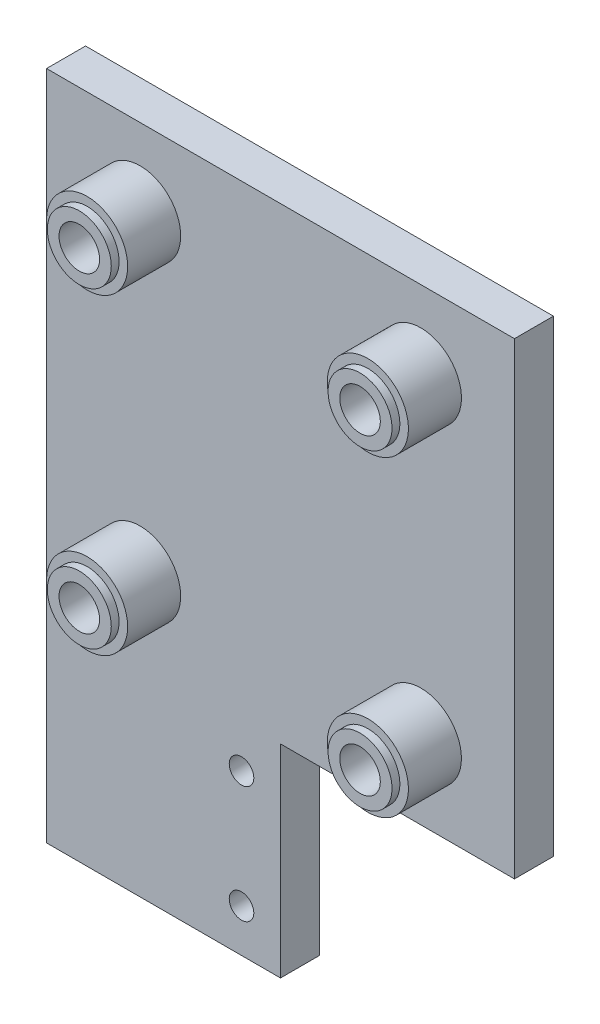
ISO-10303-21;
HEADER;
FILE_DESCRIPTION(('STEP AP214'),'2;1');
FILE_NAME('part.step','',(''),(''),'','','');
FILE_SCHEMA(('AUTOMOTIVE_DESIGN { 1 0 10303 214 1 1 1 1 }'));
ENDSEC;
DATA;
#1=APPLICATION_CONTEXT('core data for automotive mechanical design processes');
#2=APPLICATION_PROTOCOL_DEFINITION('international standard','automotive_design',2000,#1);
#3=PRODUCT_CONTEXT('',#1,'mechanical');
#4=PRODUCT('Part','Part','',(#3));
#5=PRODUCT_RELATED_PRODUCT_CATEGORY('part','',(#4));
#6=PRODUCT_DEFINITION_FORMATION('','',#4);
#7=PRODUCT_DEFINITION_CONTEXT('part definition',#1,'design');
#8=PRODUCT_DEFINITION('design','',#6,#7);
#9=PRODUCT_DEFINITION_SHAPE('','',#8);
#10=(LENGTH_UNIT() NAMED_UNIT(*) SI_UNIT(.MILLI.,.METRE.));
#11=(NAMED_UNIT(*) PLANE_ANGLE_UNIT() SI_UNIT($,.RADIAN.));
#12=(NAMED_UNIT(*) SI_UNIT($,.STERADIAN.) SOLID_ANGLE_UNIT());
#13=UNCERTAINTY_MEASURE_WITH_UNIT(LENGTH_MEASURE(1.E-05),#10,'distance_accuracy_value','');
#14=(GEOMETRIC_REPRESENTATION_CONTEXT(3) GLOBAL_UNCERTAINTY_ASSIGNED_CONTEXT((#13)) GLOBAL_UNIT_ASSIGNED_CONTEXT((#10,
#11,#12)) REPRESENTATION_CONTEXT('',''));
#15=CARTESIAN_POINT('',(0.,0.,0.));
#16=DIRECTION('',(0.,0.,1.));
#17=DIRECTION('',(1.,0.,0.));
#18=AXIS2_PLACEMENT_3D('',#15,#16,#17);
#19=CARTESIAN_POINT('',(-22.86,-25.4,16.256));
#20=DIRECTION('',(0.,0.,-1.));
#21=DIRECTION('',(-1.,0.,0.));
#22=AXIS2_PLACEMENT_3D('',#19,#20,#21);
#23=CYLINDRICAL_SURFACE('',#22,6.604);
#24=CARTESIAN_POINT('',(-22.86,-25.4,6.35));
#25=DIRECTION('',(0.,0.,-1.));
#26=DIRECTION('',(-1.,0.,0.));
#27=AXIS2_PLACEMENT_3D('',#24,#25,#26);
#28=CIRCLE('',#27,6.604);
#29=CARTESIAN_POINT('',(-29.464,-25.4,6.35));
#30=VERTEX_POINT('',#29);
#31=EDGE_CURVE('E187',#30,#30,#28,.T.);
#32=ORIENTED_EDGE('',*,*,#31,.F.);
#33=EDGE_LOOP('',(#32));
#34=FACE_BOUND('',#33,.T.);
#35=CARTESIAN_POINT('',(-22.86,-25.4,14.986));
#36=DIRECTION('',(0.,0.,-1.));
#37=DIRECTION('',(1.,0.,0.));
#38=AXIS2_PLACEMENT_3D('',#35,#36,#37);
#39=CIRCLE('',#38,6.604);
#40=CARTESIAN_POINT('',(-16.256,-25.4,14.986));
#41=VERTEX_POINT('',#40);
#42=EDGE_CURVE('E172',#41,#41,#39,.T.);
#43=ORIENTED_EDGE('',*,*,#42,.T.);
#44=EDGE_LOOP('',(#43));
#45=FACE_BOUND('',#44,.T.);
#46=ADVANCED_FACE('F39',(#34,#45),#23,.T.);
#47=CARTESIAN_POINT('',(-22.86,-25.4,16.256));
#48=DIRECTION('',(0.,0.,-1.));
#49=DIRECTION('',(-1.,0.,0.));
#50=AXIS2_PLACEMENT_3D('',#47,#48,#49);
#51=PLANE('',#50);
#52=CARTESIAN_POINT('',(-22.86,-25.4,16.256));
#53=DIRECTION('',(0.,0.,-1.));
#54=DIRECTION('',(-1.,0.,0.));
#55=AXIS2_PLACEMENT_3D('',#52,#53,#54);
#56=CIRCLE('',#55,3.302);
#57=CARTESIAN_POINT('',(-26.162,-25.4,16.256));
#58=VERTEX_POINT('',#57);
#59=EDGE_CURVE('E179',#58,#58,#56,.T.);
#60=ORIENTED_EDGE('',*,*,#59,.T.);
#61=EDGE_LOOP('',(#60));
#62=FACE_BOUND('',#61,.T.);
#63=CARTESIAN_POINT('',(-22.86,-25.4,16.256));
#64=DIRECTION('',(0.,0.,-1.));
#65=DIRECTION('',(1.,0.,0.));
#66=AXIS2_PLACEMENT_3D('',#63,#64,#65);
#67=CIRCLE('',#66,5.207);
#68=CARTESIAN_POINT('',(-17.653,-25.4,16.256));
#69=VERTEX_POINT('',#68);
#70=EDGE_CURVE('E173',#69,#69,#67,.T.);
#71=ORIENTED_EDGE('',*,*,#70,.F.);
#72=EDGE_LOOP('',(#71));
#73=FACE_BOUND('',#72,.T.);
#74=ADVANCED_FACE('F262',(#62,#73),#51,.F.);
#75=CARTESIAN_POINT('',(22.86,-25.4,16.256));
#76=DIRECTION('',(0.,0.,1.));
#77=DIRECTION('',(1.,0.,0.));
#78=AXIS2_PLACEMENT_3D('',#75,#76,#77);
#79=PLANE('',#78);
#80=CARTESIAN_POINT('',(22.86,-25.4,16.256));
#81=DIRECTION('',(0.,0.,-1.));
#82=DIRECTION('',(1.,0.,0.));
#83=AXIS2_PLACEMENT_3D('',#80,#81,#82);
#84=CIRCLE('',#83,3.302);
#85=CARTESIAN_POINT('',(26.162,-25.4,16.256));
#86=VERTEX_POINT('',#85);
#87=EDGE_CURVE('E188',#86,#86,#84,.T.);
#88=ORIENTED_EDGE('',*,*,#87,.T.);
#89=EDGE_LOOP('',(#88));
#90=FACE_BOUND('',#89,.T.);
#91=CARTESIAN_POINT('',(22.86,-25.4,16.256));
#92=DIRECTION('',(0.,0.,-1.));
#93=DIRECTION('',(-1.,0.,0.));
#94=AXIS2_PLACEMENT_3D('',#91,#92,#93);
#95=CIRCLE('',#94,5.207);
#96=CARTESIAN_POINT('',(17.653,-25.4,16.256));
#97=VERTEX_POINT('',#96);
#98=EDGE_CURVE('E141',#97,#97,#95,.T.);
#99=ORIENTED_EDGE('',*,*,#98,.F.);
#100=EDGE_LOOP('',(#99));
#101=FACE_BOUND('',#100,.T.);
#102=ADVANCED_FACE('F269',(#90,#101),#79,.T.);
#103=CARTESIAN_POINT('',(-22.86,25.4,16.256));
#104=DIRECTION('',(0.,0.,-1.));
#105=DIRECTION('',(-1.,0.,0.));
#106=AXIS2_PLACEMENT_3D('',#103,#104,#105);
#107=CYLINDRICAL_SURFACE('',#106,6.604);
#108=CARTESIAN_POINT('',(-22.86,25.4,6.35));
#109=DIRECTION('',(0.,0.,-1.));
#110=DIRECTION('',(-1.,0.,0.));
#111=AXIS2_PLACEMENT_3D('',#108,#109,#110);
#112=CIRCLE('',#111,6.604);
#113=CARTESIAN_POINT('',(-29.464,25.4,6.35));
#114=VERTEX_POINT('',#113);
#115=EDGE_CURVE('E47',#114,#114,#112,.F.);
#116=ORIENTED_EDGE('',*,*,#115,.T.);
#117=EDGE_LOOP('',(#116));
#118=FACE_BOUND('',#117,.T.);
#119=CARTESIAN_POINT('',(-22.86,25.4,14.986));
#120=DIRECTION('',(0.,0.,1.));
#121=DIRECTION('',(1.,0.,0.));
#122=AXIS2_PLACEMENT_3D('',#119,#120,#121);
#123=CIRCLE('',#122,6.604);
#124=CARTESIAN_POINT('',(-16.256,25.4,14.986));
#125=VERTEX_POINT('',#124);
#126=EDGE_CURVE('E205',#125,#125,#123,.T.);
#127=ORIENTED_EDGE('',*,*,#126,.F.);
#128=EDGE_LOOP('',(#127));
#129=FACE_BOUND('',#128,.T.);
#130=ADVANCED_FACE('F121',(#118,#129),#107,.T.);
#131=CARTESIAN_POINT('',(-22.86,25.4,16.256));
#132=DIRECTION('',(0.,0.,-1.));
#133=DIRECTION('',(-1.,0.,0.));
#134=AXIS2_PLACEMENT_3D('',#131,#132,#133);
#135=PLANE('',#134);
#136=CARTESIAN_POINT('',(-22.86,25.4,16.256));
#137=DIRECTION('',(0.,0.,1.));
#138=DIRECTION('',(-1.,0.,0.));
#139=AXIS2_PLACEMENT_3D('',#136,#137,#138);
#140=CIRCLE('',#139,3.302);
#141=CARTESIAN_POINT('',(-26.162,25.4,16.256));
#142=VERTEX_POINT('',#141);
#143=EDGE_CURVE('E225',#142,#142,#140,.T.);
#144=ORIENTED_EDGE('',*,*,#143,.F.);
#145=EDGE_LOOP('',(#144));
#146=FACE_BOUND('',#145,.T.);
#147=CARTESIAN_POINT('',(-22.86,25.4,16.256));
#148=DIRECTION('',(0.,0.,1.));
#149=DIRECTION('',(1.,0.,0.));
#150=AXIS2_PLACEMENT_3D('',#147,#148,#149);
#151=CIRCLE('',#150,5.207);
#152=CARTESIAN_POINT('',(-17.653,25.4,16.256));
#153=VERTEX_POINT('',#152);
#154=EDGE_CURVE('E206',#153,#153,#151,.T.);
#155=ORIENTED_EDGE('',*,*,#154,.T.);
#156=EDGE_LOOP('',(#155));
#157=FACE_BOUND('',#156,.T.);
#158=ADVANCED_FACE('F304',(#146,#157),#135,.F.);
#159=CARTESIAN_POINT('',(22.86,25.4,16.256));
#160=DIRECTION('',(0.,0.,1.));
#161=DIRECTION('',(1.,0.,0.));
#162=AXIS2_PLACEMENT_3D('',#159,#160,#161);
#163=PLANE('',#162);
#164=CARTESIAN_POINT('',(22.86,25.4,16.256));
#165=DIRECTION('',(0.,0.,1.));
#166=DIRECTION('',(1.,0.,0.));
#167=AXIS2_PLACEMENT_3D('',#164,#165,#166);
#168=CIRCLE('',#167,3.302);
#169=CARTESIAN_POINT('',(26.162,25.4,16.256));
#170=VERTEX_POINT('',#169);
#171=EDGE_CURVE('E222',#170,#170,#168,.T.);
#172=ORIENTED_EDGE('',*,*,#171,.F.);
#173=EDGE_LOOP('',(#172));
#174=FACE_BOUND('',#173,.T.);
#175=CARTESIAN_POINT('',(22.86,25.4,16.256));
#176=DIRECTION('',(0.,0.,1.));
#177=DIRECTION('',(-1.,0.,0.));
#178=AXIS2_PLACEMENT_3D('',#175,#176,#177);
#179=CIRCLE('',#178,5.207);
#180=CARTESIAN_POINT('',(17.653,25.4,16.256));
#181=VERTEX_POINT('',#180);
#182=EDGE_CURVE('E209',#181,#181,#179,.T.);
#183=ORIENTED_EDGE('',*,*,#182,.T.);
#184=EDGE_LOOP('',(#183));
#185=FACE_BOUND('',#184,.T.);
#186=ADVANCED_FACE('F301',(#174,#185),#163,.T.);
#187=CARTESIAN_POINT('',(-38.1,38.1,-78.5451621680164));
#188=DIRECTION('',(-1.,0.,0.));
#189=DIRECTION('',(0.,-1.,0.));
#190=AXIS2_PLACEMENT_3D('',#187,#188,#189);
#191=PLANE('',#190);
#192=DIRECTION('',(0.,0.,1.));
#193=VECTOR('',#192,1.);
#194=CARTESIAN_POINT('',(-38.1,38.1,-78.5451621680164));
#195=LINE('',#194,#193);
#196=CARTESIAN_POINT('',(-38.1,38.1,0.));
#197=VERTEX_POINT('',#196);
#198=CARTESIAN_POINT('',(-38.1,38.1,6.35));
#199=VERTEX_POINT('',#198);
#200=EDGE_CURVE('E110',#197,#199,#195,.T.);
#201=ORIENTED_EDGE('',*,*,#200,.F.);
#202=DIRECTION('',(0.,-1.,0.));
#203=VECTOR('',#202,1.);
#204=CARTESIAN_POINT('',(-38.1,38.1,0.));
#205=LINE('',#204,#203);
#206=CARTESIAN_POINT('',(-38.1,-71.12,0.));
#207=VERTEX_POINT('',#206);
#208=EDGE_CURVE('E117',#197,#207,#205,.T.);
#209=ORIENTED_EDGE('',*,*,#208,.T.);
#210=DIRECTION('',(0.,0.,-1.));
#211=VECTOR('',#210,1.);
#212=CARTESIAN_POINT('',(-38.1,-71.12,56.7675604328492));
#213=LINE('',#212,#211);
#214=CARTESIAN_POINT('',(-38.1,-71.12,6.35));
#215=VERTEX_POINT('',#214);
#216=EDGE_CURVE('E165',#215,#207,#213,.T.);
#217=ORIENTED_EDGE('',*,*,#216,.F.);
#218=DIRECTION('',(0.,-1.,0.));
#219=VECTOR('',#218,1.);
#220=CARTESIAN_POINT('',(-38.1,38.1,6.35));
#221=LINE('',#220,#219);
#222=EDGE_CURVE('E106',#199,#215,#221,.T.);
#223=ORIENTED_EDGE('',*,*,#222,.F.);
#224=EDGE_LOOP('',(#201,#209,#217,#223));
#225=FACE_BOUND('',#224,.T.);
#226=ADVANCED_FACE('F235',(#225),#191,.T.);
#227=CARTESIAN_POINT('',(-19.05,38.1,6.35));
#228=DIRECTION('',(0.,-1.,0.));
#229=DIRECTION('',(0.,0.,-1.));
#230=AXIS2_PLACEMENT_3D('',#227,#228,#229);
#231=PLANE('',#230);
#232=DIRECTION('',(-1.,0.,0.));
#233=VECTOR('',#232,1.);
#234=CARTESIAN_POINT('',(-19.05,38.1,0.));
#235=LINE('',#234,#233);
#236=CARTESIAN_POINT('',(38.1,38.1,0.));
#237=VERTEX_POINT('',#236);
#238=EDGE_CURVE('E91',#237,#197,#235,.T.);
#239=ORIENTED_EDGE('',*,*,#238,.T.);
#240=ORIENTED_EDGE('',*,*,#200,.T.);
#241=DIRECTION('',(-1.,0.,0.));
#242=VECTOR('',#241,1.);
#243=CARTESIAN_POINT('',(-19.05,38.1,6.35));
#244=LINE('',#243,#242);
#245=CARTESIAN_POINT('',(38.1,38.1,6.35));
#246=VERTEX_POINT('',#245);
#247=EDGE_CURVE('E63',#246,#199,#244,.T.);
#248=ORIENTED_EDGE('',*,*,#247,.F.);
#249=DIRECTION('',(0.,0.,1.));
#250=VECTOR('',#249,1.);
#251=CARTESIAN_POINT('',(38.1,38.1,-78.5451621680164));
#252=LINE('',#251,#250);
#253=EDGE_CURVE('E101',#237,#246,#252,.T.);
#254=ORIENTED_EDGE('',*,*,#253,.F.);
#255=EDGE_LOOP('',(#239,#240,#248,#254));
#256=FACE_BOUND('',#255,.T.);
#257=ADVANCED_FACE('F41',(#256),#231,.F.);
#258=CARTESIAN_POINT('',(-19.05,-38.1,6.35));
#259=DIRECTION('',(0.,1.,0.));
#260=DIRECTION('',(0.,0.,1.));
#261=AXIS2_PLACEMENT_3D('',#258,#259,#260);
#262=PLANE('',#261);
#263=DIRECTION('',(1.,0.,0.));
#264=VECTOR('',#263,1.);
#265=CARTESIAN_POINT('',(-19.05,-38.1,6.35));
#266=LINE('',#265,#264);
#267=CARTESIAN_POINT('',(0.,-38.1,6.35));
#268=VERTEX_POINT('',#267);
#269=CARTESIAN_POINT('',(38.1,-38.1,6.35));
#270=VERTEX_POINT('',#269);
#271=EDGE_CURVE('E115',#268,#270,#266,.T.);
#272=ORIENTED_EDGE('',*,*,#271,.F.);
#273=DIRECTION('',(0.,0.,-1.));
#274=VECTOR('',#273,1.);
#275=CARTESIAN_POINT('',(0.,-38.1,56.7675604328492));
#276=LINE('',#275,#274);
#277=CARTESIAN_POINT('',(0.,-38.1,0.));
#278=VERTEX_POINT('',#277);
#279=EDGE_CURVE('E89',#268,#278,#276,.T.);
#280=ORIENTED_EDGE('',*,*,#279,.T.);
#281=DIRECTION('',(1.,0.,0.));
#282=VECTOR('',#281,1.);
#283=CARTESIAN_POINT('',(-19.05,-38.1,0.));
#284=LINE('',#283,#282);
#285=CARTESIAN_POINT('',(38.1,-38.1,0.));
#286=VERTEX_POINT('',#285);
#287=EDGE_CURVE('E82',#278,#286,#284,.T.);
#288=ORIENTED_EDGE('',*,*,#287,.T.);
#289=DIRECTION('',(0.,0.,1.));
#290=VECTOR('',#289,1.);
#291=CARTESIAN_POINT('',(38.1,-38.1,-78.5451621680164));
#292=LINE('',#291,#290);
#293=EDGE_CURVE('E87',#286,#270,#292,.T.);
#294=ORIENTED_EDGE('',*,*,#293,.T.);
#295=EDGE_LOOP('',(#272,#280,#288,#294));
#296=FACE_BOUND('',#295,.T.);
#297=ADVANCED_FACE('F85',(#296),#262,.F.);
#298=CARTESIAN_POINT('',(0.,0.,6.35));
#299=DIRECTION('',(0.,0.,-1.));
#300=DIRECTION('',(-1.,0.,0.));
#301=AXIS2_PLACEMENT_3D('',#298,#299,#300);
#302=PLANE('',#301);
#303=CARTESIAN_POINT('',(22.86,-25.4,6.35));
#304=DIRECTION('',(0.,0.,-1.));
#305=DIRECTION('',(1.,0.,0.));
#306=AXIS2_PLACEMENT_3D('',#303,#304,#305);
#307=CIRCLE('',#306,6.604);
#308=CARTESIAN_POINT('',(29.464,-25.4,6.35));
#309=VERTEX_POINT('',#308);
#310=EDGE_CURVE('E196',#309,#309,#307,.T.);
#311=ORIENTED_EDGE('',*,*,#310,.T.);
#312=EDGE_LOOP('',(#311));
#313=FACE_BOUND('',#312,.T.);
#314=ORIENTED_EDGE('',*,*,#31,.T.);
#315=EDGE_LOOP('',(#314));
#316=FACE_BOUND('',#315,.T.);
#317=CARTESIAN_POINT('',(22.86,25.4,6.35));
#318=DIRECTION('',(0.,0.,-1.));
#319=DIRECTION('',(-1.,0.,0.));
#320=AXIS2_PLACEMENT_3D('',#317,#318,#319);
#321=CIRCLE('',#320,6.604);
#322=CARTESIAN_POINT('',(16.256,25.4,6.35));
#323=VERTEX_POINT('',#322);
#324=EDGE_CURVE('E11',#323,#323,#321,.F.);
#325=ORIENTED_EDGE('',*,*,#324,.F.);
#326=EDGE_LOOP('',(#325));
#327=FACE_BOUND('',#326,.T.);
#328=ORIENTED_EDGE('',*,*,#115,.F.);
#329=EDGE_LOOP('',(#328));
#330=FACE_BOUND('',#329,.T.);
#331=ORIENTED_EDGE('',*,*,#222,.T.);
#332=DIRECTION('',(1.,0.,0.));
#333=VECTOR('',#332,1.);
#334=CARTESIAN_POINT('',(0.,-71.12,6.35));
#335=LINE('',#334,#333);
#336=CARTESIAN_POINT('',(0.,-71.12,6.35));
#337=VERTEX_POINT('',#336);
#338=EDGE_CURVE('E146',#215,#337,#335,.T.);
#339=ORIENTED_EDGE('',*,*,#338,.T.);
#340=DIRECTION('',(0.,1.,0.));
#341=VECTOR('',#340,1.);
#342=CARTESIAN_POINT('',(0.,-38.1,6.35));
#343=LINE('',#342,#341);
#344=EDGE_CURVE('E150',#337,#268,#343,.T.);
#345=ORIENTED_EDGE('',*,*,#344,.T.);
#346=ORIENTED_EDGE('',*,*,#271,.T.);
#347=DIRECTION('',(0.,1.,0.));
#348=VECTOR('',#347,1.);
#349=CARTESIAN_POINT('',(38.1,38.1,6.35));
#350=LINE('',#349,#348);
#351=EDGE_CURVE('E104',#270,#246,#350,.T.);
#352=ORIENTED_EDGE('',*,*,#351,.T.);
#353=ORIENTED_EDGE('',*,*,#247,.T.);
#354=EDGE_LOOP('',(#331,#339,#345,#346,#352,#353));
#355=FACE_BOUND('',#354,.T.);
#356=CARTESIAN_POINT('',(-6.35,-45.085,6.35));
#357=DIRECTION('',(0.,0.,-1.));
#358=DIRECTION('',(-1.,0.,0.));
#359=AXIS2_PLACEMENT_3D('',#356,#357,#358);
#360=CIRCLE('',#359,2.);
#361=CARTESIAN_POINT('',(-8.35,-45.085,6.35));
#362=VERTEX_POINT('',#361);
#363=EDGE_CURVE('E136',#362,#362,#360,.F.);
#364=ORIENTED_EDGE('',*,*,#363,.F.);
#365=EDGE_LOOP('',(#364));
#366=FACE_BOUND('',#365,.T.);
#367=CARTESIAN_POINT('',(-6.35,-64.135,6.35));
#368=DIRECTION('',(0.,0.,-1.));
#369=DIRECTION('',(-1.,0.,0.));
#370=AXIS2_PLACEMENT_3D('',#367,#368,#369);
#371=CIRCLE('',#370,2.);
#372=CARTESIAN_POINT('',(-8.35,-64.135,6.35));
#373=VERTEX_POINT('',#372);
#374=EDGE_CURVE('E139',#373,#373,#371,.F.);
#375=ORIENTED_EDGE('',*,*,#374,.F.);
#376=EDGE_LOOP('',(#375));
#377=FACE_BOUND('',#376,.T.);
#378=ADVANCED_FACE('F124',(#313,#316,#327,#330,#355,#366,#377),#302,.F.);
#379=CARTESIAN_POINT('',(0.,0.,0.));
#380=DIRECTION('',(0.,0.,-1.));
#381=DIRECTION('',(-1.,0.,0.));
#382=AXIS2_PLACEMENT_3D('',#379,#380,#381);
#383=PLANE('',#382);
#384=CARTESIAN_POINT('',(22.86,-25.4,0.));
#385=DIRECTION('',(0.,0.,-1.));
#386=DIRECTION('',(1.,0.,0.));
#387=AXIS2_PLACEMENT_3D('',#384,#385,#386);
#388=CIRCLE('',#387,3.302);
#389=CARTESIAN_POINT('',(26.162,-25.4,0.));
#390=VERTEX_POINT('',#389);
#391=EDGE_CURVE('E184',#390,#390,#388,.T.);
#392=ORIENTED_EDGE('',*,*,#391,.F.);
#393=EDGE_LOOP('',(#392));
#394=FACE_BOUND('',#393,.T.);
#395=CARTESIAN_POINT('',(-22.86,-25.4,0.));
#396=DIRECTION('',(0.,0.,-1.));
#397=DIRECTION('',(-1.,0.,0.));
#398=AXIS2_PLACEMENT_3D('',#395,#396,#397);
#399=CIRCLE('',#398,3.302);
#400=CARTESIAN_POINT('',(-26.162,-25.4,0.));
#401=VERTEX_POINT('',#400);
#402=EDGE_CURVE('E191',#401,#401,#399,.T.);
#403=ORIENTED_EDGE('',*,*,#402,.F.);
#404=EDGE_LOOP('',(#403));
#405=FACE_BOUND('',#404,.T.);
#406=CARTESIAN_POINT('',(22.86,25.4,0.));
#407=DIRECTION('',(0.,0.,1.));
#408=DIRECTION('',(1.,0.,0.));
#409=AXIS2_PLACEMENT_3D('',#406,#407,#408);
#410=CIRCLE('',#409,3.302);
#411=CARTESIAN_POINT('',(26.162,25.4,0.));
#412=VERTEX_POINT('',#411);
#413=EDGE_CURVE('E112',#412,#412,#410,.T.);
#414=ORIENTED_EDGE('',*,*,#413,.T.);
#415=EDGE_LOOP('',(#414));
#416=FACE_BOUND('',#415,.T.);
#417=CARTESIAN_POINT('',(-22.86,25.4,0.));
#418=DIRECTION('',(0.,0.,1.));
#419=DIRECTION('',(-1.,0.,0.));
#420=AXIS2_PLACEMENT_3D('',#417,#418,#419);
#421=CIRCLE('',#420,3.302);
#422=CARTESIAN_POINT('',(-26.162,25.4,0.));
#423=VERTEX_POINT('',#422);
#424=EDGE_CURVE('E212',#423,#423,#421,.T.);
#425=ORIENTED_EDGE('',*,*,#424,.T.);
#426=EDGE_LOOP('',(#425));
#427=FACE_BOUND('',#426,.T.);
#428=ORIENTED_EDGE('',*,*,#238,.F.);
#429=DIRECTION('',(0.,1.,0.));
#430=VECTOR('',#429,1.);
#431=CARTESIAN_POINT('',(38.1,38.1,0.));
#432=LINE('',#431,#430);
#433=EDGE_CURVE('E94',#286,#237,#432,.T.);
#434=ORIENTED_EDGE('',*,*,#433,.F.);
#435=ORIENTED_EDGE('',*,*,#287,.F.);
#436=DIRECTION('',(0.,-1.,0.));
#437=VECTOR('',#436,1.);
#438=CARTESIAN_POINT('',(0.,-38.1,0.));
#439=LINE('',#438,#437);
#440=CARTESIAN_POINT('',(0.,-71.12,0.));
#441=VERTEX_POINT('',#440);
#442=EDGE_CURVE('E54',#278,#441,#439,.T.);
#443=ORIENTED_EDGE('',*,*,#442,.T.);
#444=DIRECTION('',(-1.,0.,0.));
#445=VECTOR('',#444,1.);
#446=CARTESIAN_POINT('',(0.,-71.12,0.));
#447=LINE('',#446,#445);
#448=EDGE_CURVE('E160',#441,#207,#447,.T.);
#449=ORIENTED_EDGE('',*,*,#448,.T.);
#450=ORIENTED_EDGE('',*,*,#208,.F.);
#451=EDGE_LOOP('',(#428,#434,#435,#443,#449,#450));
#452=FACE_BOUND('',#451,.T.);
#453=CARTESIAN_POINT('',(-6.35,-45.085,0.));
#454=DIRECTION('',(0.,0.,-1.));
#455=DIRECTION('',(1.,0.,0.));
#456=AXIS2_PLACEMENT_3D('',#453,#454,#455);
#457=CIRCLE('',#456,2.);
#458=CARTESIAN_POINT('',(-4.35,-45.085,0.));
#459=VERTEX_POINT('',#458);
#460=EDGE_CURVE('E153',#459,#459,#457,.T.);
#461=ORIENTED_EDGE('',*,*,#460,.F.);
#462=EDGE_LOOP('',(#461));
#463=FACE_BOUND('',#462,.T.);
#464=CARTESIAN_POINT('',(-6.35,-64.135,0.));
#465=DIRECTION('',(0.,0.,-1.));
#466=DIRECTION('',(-1.,0.,0.));
#467=AXIS2_PLACEMENT_3D('',#464,#465,#466);
#468=CIRCLE('',#467,2.);
#469=CARTESIAN_POINT('',(-8.35,-64.135,0.));
#470=VERTEX_POINT('',#469);
#471=EDGE_CURVE('E156',#470,#470,#468,.T.);
#472=ORIENTED_EDGE('',*,*,#471,.F.);
#473=EDGE_LOOP('',(#472));
#474=FACE_BOUND('',#473,.T.);
#475=ADVANCED_FACE('F95',(#394,#405,#416,#427,#452,#463,#474),#383,.T.);
#476=CARTESIAN_POINT('',(38.1,38.1,-78.5451621680164));
#477=DIRECTION('',(1.,0.,0.));
#478=DIRECTION('',(0.,1.,0.));
#479=AXIS2_PLACEMENT_3D('',#476,#477,#478);
#480=PLANE('',#479);
#481=ORIENTED_EDGE('',*,*,#293,.F.);
#482=ORIENTED_EDGE('',*,*,#433,.T.);
#483=ORIENTED_EDGE('',*,*,#253,.T.);
#484=ORIENTED_EDGE('',*,*,#351,.F.);
#485=EDGE_LOOP('',(#481,#482,#483,#484));
#486=FACE_BOUND('',#485,.T.);
#487=ADVANCED_FACE('F103',(#486),#480,.T.);
#488=CARTESIAN_POINT('',(22.86,25.4,16.256));
#489=DIRECTION('',(0.,0.,-1.));
#490=DIRECTION('',(-1.,0.,0.));
#491=AXIS2_PLACEMENT_3D('',#488,#489,#490);
#492=CYLINDRICAL_SURFACE('',#491,6.604);
#493=CARTESIAN_POINT('',(22.86,25.4,14.986));
#494=DIRECTION('',(0.,0.,1.));
#495=DIRECTION('',(-1.,0.,0.));
#496=AXIS2_PLACEMENT_3D('',#493,#494,#495);
#497=CIRCLE('',#496,6.604);
#498=CARTESIAN_POINT('',(16.256,25.4,14.986));
#499=VERTEX_POINT('',#498);
#500=EDGE_CURVE('E199',#499,#499,#497,.T.);
#501=ORIENTED_EDGE('',*,*,#500,.F.);
#502=EDGE_LOOP('',(#501));
#503=FACE_BOUND('',#502,.T.);
#504=ORIENTED_EDGE('',*,*,#324,.T.);
#505=EDGE_LOOP('',(#504));
#506=FACE_BOUND('',#505,.T.);
#507=ADVANCED_FACE('F296',(#503,#506),#492,.T.);
#508=CARTESIAN_POINT('',(22.86,25.4,0.));
#509=DIRECTION('',(0.,0.,1.));
#510=DIRECTION('',(1.,0.,0.));
#511=AXIS2_PLACEMENT_3D('',#508,#509,#510);
#512=CYLINDRICAL_SURFACE('',#511,3.302);
#513=ORIENTED_EDGE('',*,*,#413,.F.);
#514=EDGE_LOOP('',(#513));
#515=FACE_BOUND('',#514,.T.);
#516=ORIENTED_EDGE('',*,*,#171,.T.);
#517=EDGE_LOOP('',(#516));
#518=FACE_BOUND('',#517,.T.);
#519=ADVANCED_FACE('F293',(#515,#518),#512,.F.);
#520=CARTESIAN_POINT('',(-22.86,25.4,0.));
#521=DIRECTION('',(0.,0.,1.));
#522=DIRECTION('',(1.,0.,0.));
#523=AXIS2_PLACEMENT_3D('',#520,#521,#522);
#524=CYLINDRICAL_SURFACE('',#523,3.302);
#525=ORIENTED_EDGE('',*,*,#424,.F.);
#526=EDGE_LOOP('',(#525));
#527=FACE_BOUND('',#526,.T.);
#528=ORIENTED_EDGE('',*,*,#143,.T.);
#529=EDGE_LOOP('',(#528));
#530=FACE_BOUND('',#529,.T.);
#531=ADVANCED_FACE('F288',(#527,#530),#524,.F.);
#532=CARTESIAN_POINT('',(22.86,25.4,14.986));
#533=DIRECTION('',(0.,0.,-1.));
#534=DIRECTION('',(-1.,0.,0.));
#535=AXIS2_PLACEMENT_3D('',#532,#533,#534);
#536=PLANE('',#535);
#537=CARTESIAN_POINT('',(22.86,25.4,14.986));
#538=DIRECTION('',(0.,0.,1.));
#539=DIRECTION('',(-1.,0.,0.));
#540=AXIS2_PLACEMENT_3D('',#537,#538,#539);
#541=CIRCLE('',#540,5.207);
#542=CARTESIAN_POINT('',(17.653,25.4,14.986));
#543=VERTEX_POINT('',#542);
#544=EDGE_CURVE('E215',#543,#543,#541,.T.);
#545=ORIENTED_EDGE('',*,*,#544,.F.);
#546=EDGE_LOOP('',(#545));
#547=FACE_BOUND('',#546,.T.);
#548=ORIENTED_EDGE('',*,*,#500,.T.);
#549=EDGE_LOOP('',(#548));
#550=FACE_BOUND('',#549,.T.);
#551=ADVANCED_FACE('F285',(#547,#550),#536,.F.);
#552=CARTESIAN_POINT('',(22.86,25.4,14.986));
#553=DIRECTION('',(0.,0.,1.));
#554=DIRECTION('',(1.,0.,0.));
#555=AXIS2_PLACEMENT_3D('',#552,#553,#554);
#556=CYLINDRICAL_SURFACE('',#555,5.207);
#557=ORIENTED_EDGE('',*,*,#544,.T.);
#558=EDGE_LOOP('',(#557));
#559=FACE_BOUND('',#558,.T.);
#560=ORIENTED_EDGE('',*,*,#182,.F.);
#561=EDGE_LOOP('',(#560));
#562=FACE_BOUND('',#561,.T.);
#563=ADVANCED_FACE('F283',(#559,#562),#556,.T.);
#564=CARTESIAN_POINT('',(-22.86,25.4,14.986));
#565=DIRECTION('',(0.,0.,1.));
#566=DIRECTION('',(1.,0.,0.));
#567=AXIS2_PLACEMENT_3D('',#564,#565,#566);
#568=PLANE('',#567);
#569=CARTESIAN_POINT('',(-22.86,25.4,14.986));
#570=DIRECTION('',(0.,0.,1.));
#571=DIRECTION('',(1.,0.,0.));
#572=AXIS2_PLACEMENT_3D('',#569,#570,#571);
#573=CIRCLE('',#572,5.207);
#574=CARTESIAN_POINT('',(-17.653,25.4,14.986));
#575=VERTEX_POINT('',#574);
#576=EDGE_CURVE('E202',#575,#575,#573,.T.);
#577=ORIENTED_EDGE('',*,*,#576,.F.);
#578=EDGE_LOOP('',(#577));
#579=FACE_BOUND('',#578,.T.);
#580=ORIENTED_EDGE('',*,*,#126,.T.);
#581=EDGE_LOOP('',(#580));
#582=FACE_BOUND('',#581,.T.);
#583=ADVANCED_FACE('F279',(#579,#582),#568,.T.);
#584=CARTESIAN_POINT('',(-22.86,25.4,14.986));
#585=DIRECTION('',(0.,0.,1.));
#586=DIRECTION('',(1.,0.,0.));
#587=AXIS2_PLACEMENT_3D('',#584,#585,#586);
#588=CYLINDRICAL_SURFACE('',#587,5.207);
#589=ORIENTED_EDGE('',*,*,#576,.T.);
#590=EDGE_LOOP('',(#589));
#591=FACE_BOUND('',#590,.T.);
#592=ORIENTED_EDGE('',*,*,#154,.F.);
#593=EDGE_LOOP('',(#592));
#594=FACE_BOUND('',#593,.T.);
#595=ADVANCED_FACE('F276',(#591,#594),#588,.T.);
#596=CARTESIAN_POINT('',(22.86,-25.4,16.256));
#597=DIRECTION('',(0.,0.,-1.));
#598=DIRECTION('',(-1.,0.,0.));
#599=AXIS2_PLACEMENT_3D('',#596,#597,#598);
#600=CYLINDRICAL_SURFACE('',#599,6.604);
#601=CARTESIAN_POINT('',(22.86,-25.4,14.986));
#602=DIRECTION('',(0.,0.,-1.));
#603=DIRECTION('',(-1.,0.,0.));
#604=AXIS2_PLACEMENT_3D('',#601,#602,#603);
#605=CIRCLE('',#604,6.604);
#606=CARTESIAN_POINT('',(16.256,-25.4,14.986));
#607=VERTEX_POINT('',#606);
#608=EDGE_CURVE('E176',#607,#607,#605,.T.);
#609=ORIENTED_EDGE('',*,*,#608,.T.);
#610=EDGE_LOOP('',(#609));
#611=FACE_BOUND('',#610,.T.);
#612=ORIENTED_EDGE('',*,*,#310,.F.);
#613=EDGE_LOOP('',(#612));
#614=FACE_BOUND('',#613,.T.);
#615=ADVANCED_FACE('F278',(#611,#614),#600,.T.);
#616=CARTESIAN_POINT('',(22.86,-25.4,0.));
#617=DIRECTION('',(0.,0.,1.));
#618=DIRECTION('',(1.,0.,0.));
#619=AXIS2_PLACEMENT_3D('',#616,#617,#618);
#620=CYLINDRICAL_SURFACE('',#619,3.302);
#621=ORIENTED_EDGE('',*,*,#391,.T.);
#622=EDGE_LOOP('',(#621));
#623=FACE_BOUND('',#622,.T.);
#624=ORIENTED_EDGE('',*,*,#87,.F.);
#625=EDGE_LOOP('',(#624));
#626=FACE_BOUND('',#625,.T.);
#627=ADVANCED_FACE('F390',(#623,#626),#620,.F.);
#628=CARTESIAN_POINT('',(-22.86,-25.4,0.));
#629=DIRECTION('',(0.,0.,1.));
#630=DIRECTION('',(1.,0.,0.));
#631=AXIS2_PLACEMENT_3D('',#628,#629,#630);
#632=CYLINDRICAL_SURFACE('',#631,3.302);
#633=ORIENTED_EDGE('',*,*,#402,.T.);
#634=EDGE_LOOP('',(#633));
#635=FACE_BOUND('',#634,.T.);
#636=ORIENTED_EDGE('',*,*,#59,.F.);
#637=EDGE_LOOP('',(#636));
#638=FACE_BOUND('',#637,.T.);
#639=ADVANCED_FACE('F400',(#635,#638),#632,.F.);
#640=CARTESIAN_POINT('',(22.86,-25.4,14.986));
#641=DIRECTION('',(0.,0.,-1.));
#642=DIRECTION('',(-1.,0.,0.));
#643=AXIS2_PLACEMENT_3D('',#640,#641,#642);
#644=PLANE('',#643);
#645=ORIENTED_EDGE('',*,*,#608,.F.);
#646=EDGE_LOOP('',(#645));
#647=FACE_BOUND('',#646,.T.);
#648=CARTESIAN_POINT('',(22.86,-25.4,14.986));
#649=DIRECTION('',(0.,0.,-1.));
#650=DIRECTION('',(-1.,0.,0.));
#651=AXIS2_PLACEMENT_3D('',#648,#649,#650);
#652=CIRCLE('',#651,5.207);
#653=CARTESIAN_POINT('',(17.653,-25.4,14.986));
#654=VERTEX_POINT('',#653);
#655=EDGE_CURVE('E144',#654,#654,#652,.T.);
#656=ORIENTED_EDGE('',*,*,#655,.T.);
#657=EDGE_LOOP('',(#656));
#658=FACE_BOUND('',#657,.T.);
#659=ADVANCED_FACE('F410',(#647,#658),#644,.F.);
#660=CARTESIAN_POINT('',(22.86,-25.4,14.986));
#661=DIRECTION('',(0.,0.,1.));
#662=DIRECTION('',(1.,0.,0.));
#663=AXIS2_PLACEMENT_3D('',#660,#661,#662);
#664=CYLINDRICAL_SURFACE('',#663,5.207);
#665=ORIENTED_EDGE('',*,*,#655,.F.);
#666=EDGE_LOOP('',(#665));
#667=FACE_BOUND('',#666,.T.);
#668=ORIENTED_EDGE('',*,*,#98,.T.);
#669=EDGE_LOOP('',(#668));
#670=FACE_BOUND('',#669,.T.);
#671=ADVANCED_FACE('F436',(#667,#670),#664,.T.);
#672=CARTESIAN_POINT('',(-22.86,-25.4,14.986));
#673=DIRECTION('',(0.,0.,1.));
#674=DIRECTION('',(1.,0.,0.));
#675=AXIS2_PLACEMENT_3D('',#672,#673,#674);
#676=PLANE('',#675);
#677=ORIENTED_EDGE('',*,*,#42,.F.);
#678=EDGE_LOOP('',(#677));
#679=FACE_BOUND('',#678,.T.);
#680=CARTESIAN_POINT('',(-22.86,-25.4,14.986));
#681=DIRECTION('',(0.,0.,-1.));
#682=DIRECTION('',(1.,0.,0.));
#683=AXIS2_PLACEMENT_3D('',#680,#681,#682);
#684=CIRCLE('',#683,5.207);
#685=CARTESIAN_POINT('',(-17.653,-25.4,14.986));
#686=VERTEX_POINT('',#685);
#687=EDGE_CURVE('E169',#686,#686,#684,.T.);
#688=ORIENTED_EDGE('',*,*,#687,.T.);
#689=EDGE_LOOP('',(#688));
#690=FACE_BOUND('',#689,.T.);
#691=ADVANCED_FACE('F446',(#679,#690),#676,.T.);
#692=CARTESIAN_POINT('',(-22.86,-25.4,14.986));
#693=DIRECTION('',(0.,0.,1.));
#694=DIRECTION('',(1.,0.,0.));
#695=AXIS2_PLACEMENT_3D('',#692,#693,#694);
#696=CYLINDRICAL_SURFACE('',#695,5.207);
#697=ORIENTED_EDGE('',*,*,#687,.F.);
#698=EDGE_LOOP('',(#697));
#699=FACE_BOUND('',#698,.T.);
#700=ORIENTED_EDGE('',*,*,#70,.T.);
#701=EDGE_LOOP('',(#700));
#702=FACE_BOUND('',#701,.T.);
#703=ADVANCED_FACE('F258',(#699,#702),#696,.T.);
#704=CARTESIAN_POINT('',(0.,-71.12,56.7675604328492));
#705=DIRECTION('',(0.,-1.,0.));
#706=DIRECTION('',(0.,0.,-1.));
#707=AXIS2_PLACEMENT_3D('',#704,#705,#706);
#708=PLANE('',#707);
#709=ORIENTED_EDGE('',*,*,#338,.F.);
#710=ORIENTED_EDGE('',*,*,#216,.T.);
#711=ORIENTED_EDGE('',*,*,#448,.F.);
#712=DIRECTION('',(0.,0.,-1.));
#713=VECTOR('',#712,1.);
#714=CARTESIAN_POINT('',(0.,-71.12,56.7675604328492));
#715=LINE('',#714,#713);
#716=EDGE_CURVE('E163',#337,#441,#715,.T.);
#717=ORIENTED_EDGE('',*,*,#716,.F.);
#718=EDGE_LOOP('',(#709,#710,#711,#717));
#719=FACE_BOUND('',#718,.T.);
#720=ADVANCED_FACE('F242',(#719),#708,.T.);
#721=CARTESIAN_POINT('',(0.,-38.1,56.7675604328492));
#722=DIRECTION('',(1.,0.,0.));
#723=DIRECTION('',(0.,1.,0.));
#724=AXIS2_PLACEMENT_3D('',#721,#722,#723);
#725=PLANE('',#724);
#726=ORIENTED_EDGE('',*,*,#344,.F.);
#727=ORIENTED_EDGE('',*,*,#716,.T.);
#728=ORIENTED_EDGE('',*,*,#442,.F.);
#729=ORIENTED_EDGE('',*,*,#279,.F.);
#730=EDGE_LOOP('',(#726,#727,#728,#729));
#731=FACE_BOUND('',#730,.T.);
#732=ADVANCED_FACE('F244',(#731),#725,.T.);
#733=CARTESIAN_POINT('',(-6.35,-64.135,56.7675604328492));
#734=DIRECTION('',(0.,0.,-1.));
#735=DIRECTION('',(-1.,0.,0.));
#736=AXIS2_PLACEMENT_3D('',#733,#734,#735);
#737=CYLINDRICAL_SURFACE('',#736,2.);
#738=ORIENTED_EDGE('',*,*,#374,.T.);
#739=EDGE_LOOP('',(#738));
#740=FACE_BOUND('',#739,.T.);
#741=ORIENTED_EDGE('',*,*,#471,.T.);
#742=EDGE_LOOP('',(#741));
#743=FACE_BOUND('',#742,.T.);
#744=ADVANCED_FACE('F250',(#740,#743),#737,.F.);
#745=CARTESIAN_POINT('',(-6.35,-45.085,56.7675604328492));
#746=DIRECTION('',(0.,0.,-1.));
#747=DIRECTION('',(-1.,0.,0.));
#748=AXIS2_PLACEMENT_3D('',#745,#746,#747);
#749=CYLINDRICAL_SURFACE('',#748,2.);
#750=ORIENTED_EDGE('',*,*,#363,.T.);
#751=EDGE_LOOP('',(#750));
#752=FACE_BOUND('',#751,.T.);
#753=ORIENTED_EDGE('',*,*,#460,.T.);
#754=EDGE_LOOP('',(#753));
#755=FACE_BOUND('',#754,.T.);
#756=ADVANCED_FACE('F256',(#752,#755),#749,.F.);
#757=CLOSED_SHELL('',(#46,#74,#102,#130,#158,#186,#226,#257,#297,#378,#475,#487,#507,#519,#531,
#551,#563,#583,#595,#615,#627,#639,#659,#671,#691,#703,#720,#732,#744,#756));
#758=MANIFOLD_SOLID_BREP('B2',#757);
#759=ADVANCED_BREP_SHAPE_REPRESENTATION('',(#18,#758),#14);
#760=SHAPE_DEFINITION_REPRESENTATION(#9,#759);
ENDSEC;
END-ISO-10303-21;
